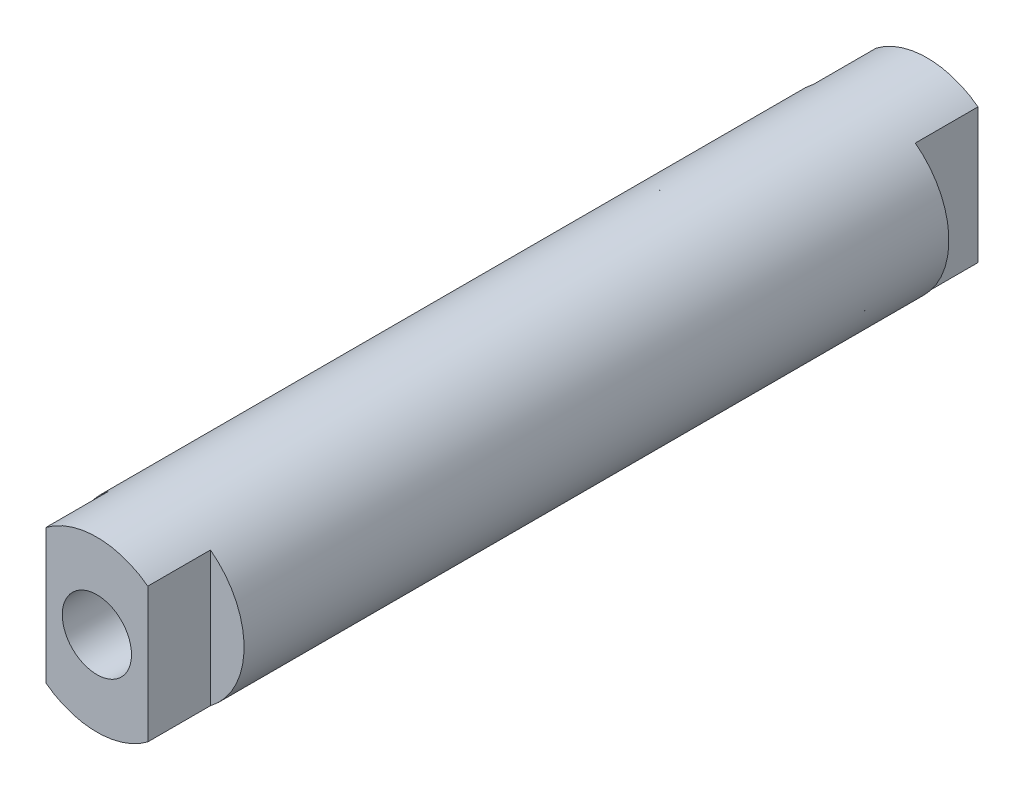
ISO-10303-21;
HEADER;
FILE_DESCRIPTION(('STEP AP214'),'2;1');
FILE_NAME('part.step','',(''),(''),'','','');
FILE_SCHEMA(('AUTOMOTIVE_DESIGN { 1 0 10303 214 1 1 1 1 }'));
ENDSEC;
DATA;
#1=APPLICATION_CONTEXT('core data for automotive mechanical design processes');
#2=APPLICATION_PROTOCOL_DEFINITION('international standard','automotive_design',2000,#1);
#3=PRODUCT_CONTEXT('',#1,'mechanical');
#4=PRODUCT('Part','Part','',(#3));
#5=PRODUCT_RELATED_PRODUCT_CATEGORY('part','',(#4));
#6=PRODUCT_DEFINITION_FORMATION('','',#4);
#7=PRODUCT_DEFINITION_CONTEXT('part definition',#1,'design');
#8=PRODUCT_DEFINITION('design','',#6,#7);
#9=PRODUCT_DEFINITION_SHAPE('','',#8);
#10=(LENGTH_UNIT() NAMED_UNIT(*) SI_UNIT(.MILLI.,.METRE.));
#11=(NAMED_UNIT(*) PLANE_ANGLE_UNIT() SI_UNIT($,.RADIAN.));
#12=(NAMED_UNIT(*) SI_UNIT($,.STERADIAN.) SOLID_ANGLE_UNIT());
#13=UNCERTAINTY_MEASURE_WITH_UNIT(LENGTH_MEASURE(1.E-05),#10,'distance_accuracy_value','');
#14=(GEOMETRIC_REPRESENTATION_CONTEXT(3) GLOBAL_UNCERTAINTY_ASSIGNED_CONTEXT((#13)) GLOBAL_UNIT_ASSIGNED_CONTEXT((#10,
#11,#12)) REPRESENTATION_CONTEXT('',''));
#15=CARTESIAN_POINT('',(0.,0.,0.));
#16=DIRECTION('',(0.,0.,1.));
#17=DIRECTION('',(1.,0.,0.));
#18=AXIS2_PLACEMENT_3D('',#15,#16,#17);
#19=CARTESIAN_POINT('',(0.,0.,53.975));
#20=DIRECTION('',(0.,0.,-1.));
#21=DIRECTION('',(-1.,0.,0.));
#22=AXIS2_PLACEMENT_3D('',#19,#20,#21);
#23=CYLINDRICAL_SURFACE('',#22,10.9855);
#24=CARTESIAN_POINT('',(0.,0.,53.975));
#25=DIRECTION('',(0.,0.,1.));
#26=DIRECTION('',(1.,0.,0.));
#27=AXIS2_PLACEMENT_3D('',#24,#25,#26);
#28=CIRCLE('',#27,10.9855);
#29=CARTESIAN_POINT('',(6.6167,8.76929252334531,53.975));
#30=VERTEX_POINT('',#29);
#31=CARTESIAN_POINT('',(-6.6167,8.76929252334531,53.975));
#32=VERTEX_POINT('',#31);
#33=EDGE_CURVE('E43',#30,#32,#28,.T.);
#34=ORIENTED_EDGE('',*,*,#33,.F.);
#35=DIRECTION('',(0.,0.,1.));
#36=VECTOR('',#35,1.);
#37=CARTESIAN_POINT('',(6.6167,8.76929252334531,45.8216));
#38=LINE('',#37,#36);
#39=CARTESIAN_POINT('',(6.6167,8.76929252334531,45.8216));
#40=VERTEX_POINT('',#39);
#41=EDGE_CURVE('E138',#40,#30,#38,.T.);
#42=ORIENTED_EDGE('',*,*,#41,.F.);
#43=CARTESIAN_POINT('',(0.,0.,45.8216));
#44=DIRECTION('',(0.,0.,1.));
#45=DIRECTION('',(1.,0.,0.));
#46=AXIS2_PLACEMENT_3D('',#43,#44,#45);
#47=CIRCLE('',#46,10.9855);
#48=CARTESIAN_POINT('',(6.6167,-8.76929252334531,45.8216));
#49=VERTEX_POINT('',#48);
#50=EDGE_CURVE('E133',#49,#40,#47,.T.);
#51=ORIENTED_EDGE('',*,*,#50,.F.);
#52=DIRECTION('',(0.,0.,1.));
#53=VECTOR('',#52,1.);
#54=CARTESIAN_POINT('',(6.6167,-8.76929252334531,45.8216));
#55=LINE('',#54,#53);
#56=CARTESIAN_POINT('',(6.6167,-8.76929252334531,53.975));
#57=VERTEX_POINT('',#56);
#58=EDGE_CURVE('E140',#49,#57,#55,.T.);
#59=ORIENTED_EDGE('',*,*,#58,.T.);
#60=CARTESIAN_POINT('',(-6.6167,-8.76929252334531,53.975));
#61=VERTEX_POINT('',#60);
#62=EDGE_CURVE('E12',#61,#57,#28,.T.);
#63=ORIENTED_EDGE('',*,*,#62,.F.);
#64=DIRECTION('',(0.,0.,1.));
#65=VECTOR('',#64,1.);
#66=CARTESIAN_POINT('',(-6.6167,-8.76929252334531,45.8216));
#67=LINE('',#66,#65);
#68=CARTESIAN_POINT('',(-6.6167,-8.76929252334531,45.8216));
#69=VERTEX_POINT('',#68);
#70=EDGE_CURVE('E150',#69,#61,#67,.T.);
#71=ORIENTED_EDGE('',*,*,#70,.F.);
#72=CARTESIAN_POINT('',(0.,0.,45.8216));
#73=DIRECTION('',(0.,0.,1.));
#74=DIRECTION('',(1.,0.,0.));
#75=AXIS2_PLACEMENT_3D('',#72,#73,#74);
#76=CIRCLE('',#75,10.9855);
#77=CARTESIAN_POINT('',(-6.6167,8.76929252334531,45.8216));
#78=VERTEX_POINT('',#77);
#79=EDGE_CURVE('E145',#78,#69,#76,.T.);
#80=ORIENTED_EDGE('',*,*,#79,.F.);
#81=DIRECTION('',(0.,0.,1.));
#82=VECTOR('',#81,1.);
#83=CARTESIAN_POINT('',(-6.6167,8.76929252334531,45.8216));
#84=LINE('',#83,#82);
#85=EDGE_CURVE('E153',#78,#32,#84,.T.);
#86=ORIENTED_EDGE('',*,*,#85,.T.);
#87=EDGE_LOOP('',(#34,#42,#51,#59,#63,#71,#80,#86));
#88=FACE_BOUND('',#87,.T.);
#89=DIRECTION('',(0.,0.,-1.));
#90=VECTOR('',#89,1.);
#91=CARTESIAN_POINT('',(6.6167,-8.76929252334531,-45.8216));
#92=LINE('',#91,#90);
#93=CARTESIAN_POINT('',(6.6167,-8.76929252334531,-45.8216));
#94=VERTEX_POINT('',#93);
#95=CARTESIAN_POINT('',(6.6167,-8.76929252334531,-53.975));
#96=VERTEX_POINT('',#95);
#97=EDGE_CURVE('E51',#94,#96,#92,.T.);
#98=ORIENTED_EDGE('',*,*,#97,.F.);
#99=CARTESIAN_POINT('',(0.,0.,-45.8216));
#100=DIRECTION('',(0.,0.,1.));
#101=DIRECTION('',(1.,0.,0.));
#102=AXIS2_PLACEMENT_3D('',#99,#100,#101);
#103=CIRCLE('',#102,10.9855);
#104=CARTESIAN_POINT('',(6.6167,8.76929252334531,-45.8216));
#105=VERTEX_POINT('',#104);
#106=EDGE_CURVE('E107',#94,#105,#103,.T.);
#107=ORIENTED_EDGE('',*,*,#106,.T.);
#108=DIRECTION('',(0.,0.,-1.));
#109=VECTOR('',#108,1.);
#110=CARTESIAN_POINT('',(6.6167,8.76929252334531,-45.8216));
#111=LINE('',#110,#109);
#112=CARTESIAN_POINT('',(6.6167,8.76929252334531,-53.975));
#113=VERTEX_POINT('',#112);
#114=EDGE_CURVE('E104',#105,#113,#111,.T.);
#115=ORIENTED_EDGE('',*,*,#114,.T.);
#116=CARTESIAN_POINT('',(0.,0.,-53.975));
#117=DIRECTION('',(0.,0.,1.));
#118=DIRECTION('',(1.,0.,0.));
#119=AXIS2_PLACEMENT_3D('',#116,#117,#118);
#120=CIRCLE('',#119,10.9855);
#121=CARTESIAN_POINT('',(-6.6167,8.76929252334531,-53.975));
#122=VERTEX_POINT('',#121);
#123=EDGE_CURVE('E59',#113,#122,#120,.T.);
#124=ORIENTED_EDGE('',*,*,#123,.T.);
#125=DIRECTION('',(0.,0.,-1.));
#126=VECTOR('',#125,1.);
#127=CARTESIAN_POINT('',(-6.6167,8.76929252334531,-45.8216));
#128=LINE('',#127,#126);
#129=CARTESIAN_POINT('',(-6.6167,8.76929252334531,-45.8216));
#130=VERTEX_POINT('',#129);
#131=EDGE_CURVE('E126',#130,#122,#128,.T.);
#132=ORIENTED_EDGE('',*,*,#131,.F.);
#133=CARTESIAN_POINT('',(0.,0.,-45.8216));
#134=DIRECTION('',(0.,0.,1.));
#135=DIRECTION('',(1.,0.,0.));
#136=AXIS2_PLACEMENT_3D('',#133,#134,#135);
#137=CIRCLE('',#136,10.9855);
#138=CARTESIAN_POINT('',(-6.6167,-8.76929252334531,-45.8216));
#139=VERTEX_POINT('',#138);
#140=EDGE_CURVE('E121',#130,#139,#137,.T.);
#141=ORIENTED_EDGE('',*,*,#140,.T.);
#142=DIRECTION('',(0.,0.,-1.));
#143=VECTOR('',#142,1.);
#144=CARTESIAN_POINT('',(-6.6167,-8.76929252334531,-45.8216));
#145=LINE('',#144,#143);
#146=CARTESIAN_POINT('',(-6.6167,-8.76929252334531,-53.975));
#147=VERTEX_POINT('',#146);
#148=EDGE_CURVE('E129',#139,#147,#145,.T.);
#149=ORIENTED_EDGE('',*,*,#148,.T.);
#150=EDGE_CURVE('E115',#147,#96,#120,.T.);
#151=ORIENTED_EDGE('',*,*,#150,.T.);
#152=EDGE_LOOP('',(#98,#107,#115,#124,#132,#141,#149,#151));
#153=FACE_BOUND('',#152,.T.);
#154=ADVANCED_FACE('F35',(#88,#153),#23,.T.);
#155=CARTESIAN_POINT('',(0.,0.,-53.975));
#156=DIRECTION('',(0.,0.,1.));
#157=DIRECTION('',(1.,0.,0.));
#158=AXIS2_PLACEMENT_3D('',#155,#156,#157);
#159=PLANE('',#158);
#160=CARTESIAN_POINT('',(0.,0.,-53.975));
#161=DIRECTION('',(0.,0.,1.));
#162=DIRECTION('',(1.,0.,0.));
#163=AXIS2_PLACEMENT_3D('',#160,#161,#162);
#164=CIRCLE('',#163,4.5);
#165=CARTESIAN_POINT('',(4.5,0.,-53.975));
#166=VERTEX_POINT('',#165);
#167=EDGE_CURVE('E196',#166,#166,#164,.T.);
#168=ORIENTED_EDGE('',*,*,#167,.T.);
#169=EDGE_LOOP('',(#168));
#170=FACE_BOUND('',#169,.T.);
#171=DIRECTION('',(0.,-1.,0.));
#172=VECTOR('',#171,1.);
#173=CARTESIAN_POINT('',(6.6167,-8.76929252334531,-53.975));
#174=LINE('',#173,#172);
#175=EDGE_CURVE('E110',#113,#96,#174,.T.);
#176=ORIENTED_EDGE('',*,*,#175,.T.);
#177=ORIENTED_EDGE('',*,*,#150,.F.);
#178=DIRECTION('',(0.,1.,0.));
#179=VECTOR('',#178,1.);
#180=CARTESIAN_POINT('',(-6.6167,8.76929252334531,-53.975));
#181=LINE('',#180,#179);
#182=EDGE_CURVE('E117',#147,#122,#181,.T.);
#183=ORIENTED_EDGE('',*,*,#182,.T.);
#184=ORIENTED_EDGE('',*,*,#123,.F.);
#185=EDGE_LOOP('',(#176,#177,#183,#184));
#186=FACE_BOUND('',#185,.T.);
#187=ADVANCED_FACE('F183',(#170,#186),#159,.F.);
#188=CARTESIAN_POINT('',(0.,0.,53.975));
#189=DIRECTION('',(0.,0.,1.));
#190=DIRECTION('',(1.,0.,0.));
#191=AXIS2_PLACEMENT_3D('',#188,#189,#190);
#192=PLANE('',#191);
#193=CARTESIAN_POINT('',(0.,0.,53.975));
#194=DIRECTION('',(0.,0.,1.));
#195=DIRECTION('',(1.,0.,0.));
#196=AXIS2_PLACEMENT_3D('',#193,#194,#195);
#197=CIRCLE('',#196,4.5);
#198=CARTESIAN_POINT('',(4.5,0.,53.975));
#199=VERTEX_POINT('',#198);
#200=EDGE_CURVE('E207',#199,#199,#197,.T.);
#201=ORIENTED_EDGE('',*,*,#200,.F.);
#202=EDGE_LOOP('',(#201));
#203=FACE_BOUND('',#202,.T.);
#204=DIRECTION('',(0.,-1.,0.));
#205=VECTOR('',#204,1.);
#206=CARTESIAN_POINT('',(6.6167,-8.76929252334531,53.975));
#207=LINE('',#206,#205);
#208=EDGE_CURVE('E131',#30,#57,#207,.T.);
#209=ORIENTED_EDGE('',*,*,#208,.F.);
#210=ORIENTED_EDGE('',*,*,#33,.T.);
#211=DIRECTION('',(0.,1.,0.));
#212=VECTOR('',#211,1.);
#213=CARTESIAN_POINT('',(-6.6167,8.76929252334531,53.975));
#214=LINE('',#213,#212);
#215=EDGE_CURVE('E143',#61,#32,#214,.T.);
#216=ORIENTED_EDGE('',*,*,#215,.F.);
#217=ORIENTED_EDGE('',*,*,#62,.T.);
#218=EDGE_LOOP('',(#209,#210,#216,#217));
#219=FACE_BOUND('',#218,.T.);
#220=ADVANCED_FACE('F160',(#203,#219),#192,.T.);
#221=CARTESIAN_POINT('',(-6.6167,8.76929252334531,45.8216));
#222=DIRECTION('',(1.,0.,0.));
#223=DIRECTION('',(0.,0.,-1.));
#224=AXIS2_PLACEMENT_3D('',#221,#222,#223);
#225=PLANE('',#224);
#226=ORIENTED_EDGE('',*,*,#215,.T.);
#227=ORIENTED_EDGE('',*,*,#85,.F.);
#228=DIRECTION('',(0.,1.,0.));
#229=VECTOR('',#228,1.);
#230=CARTESIAN_POINT('',(-6.6167,8.76929252334531,45.8216));
#231=LINE('',#230,#229);
#232=EDGE_CURVE('E147',#69,#78,#231,.T.);
#233=ORIENTED_EDGE('',*,*,#232,.F.);
#234=ORIENTED_EDGE('',*,*,#70,.T.);
#235=EDGE_LOOP('',(#226,#227,#233,#234));
#236=FACE_BOUND('',#235,.T.);
#237=ADVANCED_FACE('F165',(#236),#225,.F.);
#238=CARTESIAN_POINT('',(0.,0.,45.8216));
#239=DIRECTION('',(0.,0.,1.));
#240=DIRECTION('',(1.,0.,0.));
#241=AXIS2_PLACEMENT_3D('',#238,#239,#240);
#242=PLANE('',#241);
#243=ORIENTED_EDGE('',*,*,#79,.T.);
#244=ORIENTED_EDGE('',*,*,#232,.T.);
#245=EDGE_LOOP('',(#243,#244));
#246=FACE_BOUND('',#245,.T.);
#247=ADVANCED_FACE('F170',(#246),#242,.T.);
#248=CARTESIAN_POINT('',(6.6167,-8.76929252334531,45.8216));
#249=DIRECTION('',(-1.,0.,0.));
#250=DIRECTION('',(0.,0.,1.));
#251=AXIS2_PLACEMENT_3D('',#248,#249,#250);
#252=PLANE('',#251);
#253=ORIENTED_EDGE('',*,*,#208,.T.);
#254=ORIENTED_EDGE('',*,*,#58,.F.);
#255=DIRECTION('',(0.,-1.,0.));
#256=VECTOR('',#255,1.);
#257=CARTESIAN_POINT('',(6.6167,-8.76929252334531,45.8216));
#258=LINE('',#257,#256);
#259=EDGE_CURVE('E135',#40,#49,#258,.T.);
#260=ORIENTED_EDGE('',*,*,#259,.F.);
#261=ORIENTED_EDGE('',*,*,#41,.T.);
#262=EDGE_LOOP('',(#253,#254,#260,#261));
#263=FACE_BOUND('',#262,.T.);
#264=ADVANCED_FACE('F172',(#263),#252,.F.);
#265=CARTESIAN_POINT('',(0.,0.,45.8216));
#266=DIRECTION('',(0.,0.,1.));
#267=DIRECTION('',(1.,0.,0.));
#268=AXIS2_PLACEMENT_3D('',#265,#266,#267);
#269=PLANE('',#268);
#270=ORIENTED_EDGE('',*,*,#50,.T.);
#271=ORIENTED_EDGE('',*,*,#259,.T.);
#272=EDGE_LOOP('',(#270,#271));
#273=FACE_BOUND('',#272,.T.);
#274=ADVANCED_FACE('F178',(#273),#269,.T.);
#275=CARTESIAN_POINT('',(-6.6167,8.76929252334531,-45.8216));
#276=DIRECTION('',(-1.,0.,0.));
#277=DIRECTION('',(0.,0.,1.));
#278=AXIS2_PLACEMENT_3D('',#275,#276,#277);
#279=PLANE('',#278);
#280=ORIENTED_EDGE('',*,*,#182,.F.);
#281=ORIENTED_EDGE('',*,*,#148,.F.);
#282=DIRECTION('',(0.,1.,0.));
#283=VECTOR('',#282,1.);
#284=CARTESIAN_POINT('',(-6.6167,8.76929252334531,-45.8216));
#285=LINE('',#284,#283);
#286=EDGE_CURVE('E124',#139,#130,#285,.T.);
#287=ORIENTED_EDGE('',*,*,#286,.T.);
#288=ORIENTED_EDGE('',*,*,#131,.T.);
#289=EDGE_LOOP('',(#280,#281,#287,#288));
#290=FACE_BOUND('',#289,.T.);
#291=ADVANCED_FACE('F243',(#290),#279,.T.);
#292=CARTESIAN_POINT('',(0.,0.,-45.8216));
#293=DIRECTION('',(0.,0.,-1.));
#294=DIRECTION('',(1.,0.,0.));
#295=AXIS2_PLACEMENT_3D('',#292,#293,#294);
#296=PLANE('',#295);
#297=ORIENTED_EDGE('',*,*,#140,.F.);
#298=ORIENTED_EDGE('',*,*,#286,.F.);
#299=EDGE_LOOP('',(#297,#298));
#300=FACE_BOUND('',#299,.T.);
#301=ADVANCED_FACE('F240',(#300),#296,.T.);
#302=CARTESIAN_POINT('',(6.6167,-8.76929252334531,-45.8216));
#303=DIRECTION('',(1.,0.,0.));
#304=DIRECTION('',(0.,0.,-1.));
#305=AXIS2_PLACEMENT_3D('',#302,#303,#304);
#306=PLANE('',#305);
#307=ORIENTED_EDGE('',*,*,#175,.F.);
#308=ORIENTED_EDGE('',*,*,#114,.F.);
#309=DIRECTION('',(0.,-1.,0.));
#310=VECTOR('',#309,1.);
#311=CARTESIAN_POINT('',(6.6167,-8.76929252334531,-45.8216));
#312=LINE('',#311,#310);
#313=EDGE_CURVE('E101',#105,#94,#312,.T.);
#314=ORIENTED_EDGE('',*,*,#313,.T.);
#315=ORIENTED_EDGE('',*,*,#97,.T.);
#316=EDGE_LOOP('',(#307,#308,#314,#315));
#317=FACE_BOUND('',#316,.T.);
#318=ADVANCED_FACE('F103',(#317),#306,.T.);
#319=CARTESIAN_POINT('',(0.,0.,-45.8216));
#320=DIRECTION('',(0.,0.,-1.));
#321=DIRECTION('',(1.,0.,0.));
#322=AXIS2_PLACEMENT_3D('',#319,#320,#321);
#323=PLANE('',#322);
#324=ORIENTED_EDGE('',*,*,#106,.F.);
#325=ORIENTED_EDGE('',*,*,#313,.F.);
#326=EDGE_LOOP('',(#324,#325));
#327=FACE_BOUND('',#326,.T.);
#328=ADVANCED_FACE('F109',(#327),#323,.T.);
#329=CARTESIAN_POINT('',(0.,0.,-53.975));
#330=DIRECTION('',(0.,0.,1.));
#331=DIRECTION('',(1.,0.,0.));
#332=AXIS2_PLACEMENT_3D('',#329,#330,#331);
#333=CYLINDRICAL_SURFACE('',#332,4.5);
#334=ORIENTED_EDGE('',*,*,#200,.T.);
#335=EDGE_LOOP('',(#334));
#336=FACE_BOUND('',#335,.T.);
#337=CARTESIAN_POINT('',(0.,0.,42.8216));
#338=DIRECTION('',(0.,0.,1.));
#339=DIRECTION('',(1.,0.,0.));
#340=AXIS2_PLACEMENT_3D('',#337,#338,#339);
#341=CIRCLE('',#340,4.5);
#342=CARTESIAN_POINT('',(4.5,0.,42.8216));
#343=VERTEX_POINT('',#342);
#344=EDGE_CURVE('E38',#343,#343,#341,.T.);
#345=ORIENTED_EDGE('',*,*,#344,.F.);
#346=EDGE_LOOP('',(#345));
#347=FACE_BOUND('',#346,.T.);
#348=ADVANCED_FACE('F216',(#336,#347),#333,.F.);
#349=ORIENTED_EDGE('',*,*,#167,.F.);
#350=EDGE_LOOP('',(#349));
#351=FACE_BOUND('',#350,.T.);
#352=CARTESIAN_POINT('',(0.,0.,-42.8216));
#353=DIRECTION('',(0.,0.,-1.));
#354=DIRECTION('',(-1.,0.,0.));
#355=AXIS2_PLACEMENT_3D('',#352,#353,#354);
#356=CIRCLE('',#355,4.5);
#357=CARTESIAN_POINT('',(-4.5,0.,-42.8216));
#358=VERTEX_POINT('',#357);
#359=EDGE_CURVE('E204',#358,#358,#356,.T.);
#360=ORIENTED_EDGE('',*,*,#359,.F.);
#361=EDGE_LOOP('',(#360));
#362=FACE_BOUND('',#361,.T.);
#363=ADVANCED_FACE('F218',(#351,#362),#333,.F.);
#364=CARTESIAN_POINT('',(0.,0.,-42.8216));
#365=DIRECTION('',(0.,0.,-1.));
#366=DIRECTION('',(1.,0.,0.));
#367=AXIS2_PLACEMENT_3D('',#364,#365,#366);
#368=PLANE('',#367);
#369=ORIENTED_EDGE('',*,*,#359,.T.);
#370=EDGE_LOOP('',(#369));
#371=FACE_BOUND('',#370,.T.);
#372=CARTESIAN_POINT('',(0.,0.,-42.8216));
#373=DIRECTION('',(0.,0.,-1.));
#374=DIRECTION('',(-1.,0.,0.));
#375=AXIS2_PLACEMENT_3D('',#372,#373,#374);
#376=CIRCLE('',#375,9.525);
#377=CARTESIAN_POINT('',(-9.525,0.,-42.8216));
#378=VERTEX_POINT('',#377);
#379=EDGE_CURVE('E197',#378,#378,#376,.F.);
#380=ORIENTED_EDGE('',*,*,#379,.T.);
#381=EDGE_LOOP('',(#380));
#382=FACE_BOUND('',#381,.T.);
#383=ADVANCED_FACE('F225',(#371,#382),#368,.F.);
#384=CARTESIAN_POINT('',(0.,0.,42.8216));
#385=DIRECTION('',(0.,0.,1.));
#386=DIRECTION('',(1.,0.,0.));
#387=AXIS2_PLACEMENT_3D('',#384,#385,#386);
#388=PLANE('',#387);
#389=ORIENTED_EDGE('',*,*,#344,.T.);
#390=EDGE_LOOP('',(#389));
#391=FACE_BOUND('',#390,.T.);
#392=CARTESIAN_POINT('',(0.,0.,42.8216));
#393=DIRECTION('',(0.,0.,1.));
#394=DIRECTION('',(1.,0.,0.));
#395=AXIS2_PLACEMENT_3D('',#392,#393,#394);
#396=CIRCLE('',#395,9.525);
#397=CARTESIAN_POINT('',(9.525,0.,42.8216));
#398=VERTEX_POINT('',#397);
#399=EDGE_CURVE('E199',#398,#398,#396,.T.);
#400=ORIENTED_EDGE('',*,*,#399,.F.);
#401=EDGE_LOOP('',(#400));
#402=FACE_BOUND('',#401,.T.);
#403=ADVANCED_FACE('F213',(#391,#402),#388,.F.);
#404=CARTESIAN_POINT('',(0.,0.,-72.7623683632075));
#405=DIRECTION('',(0.,0.,1.));
#406=DIRECTION('',(1.,0.,0.));
#407=AXIS2_PLACEMENT_3D('',#404,#405,#406);
#408=CYLINDRICAL_SURFACE('',#407,9.525);
#409=ORIENTED_EDGE('',*,*,#399,.T.);
#410=EDGE_LOOP('',(#409));
#411=FACE_BOUND('',#410,.T.);
#412=ORIENTED_EDGE('',*,*,#379,.F.);
#413=EDGE_LOOP('',(#412));
#414=FACE_BOUND('',#413,.T.);
#415=ADVANCED_FACE('F231',(#411,#414),#408,.F.);
#416=CLOSED_SHELL('',(#154,#187,#220,#237,#247,#264,#274,#291,#301,#318,#328,#348,#363,#383,
#403,#415));
#417=MANIFOLD_SOLID_BREP('B2',#416);
#418=ADVANCED_BREP_SHAPE_REPRESENTATION('',(#18,#417),#14);
#419=SHAPE_DEFINITION_REPRESENTATION(#9,#418);
ENDSEC;
END-ISO-10303-21;
